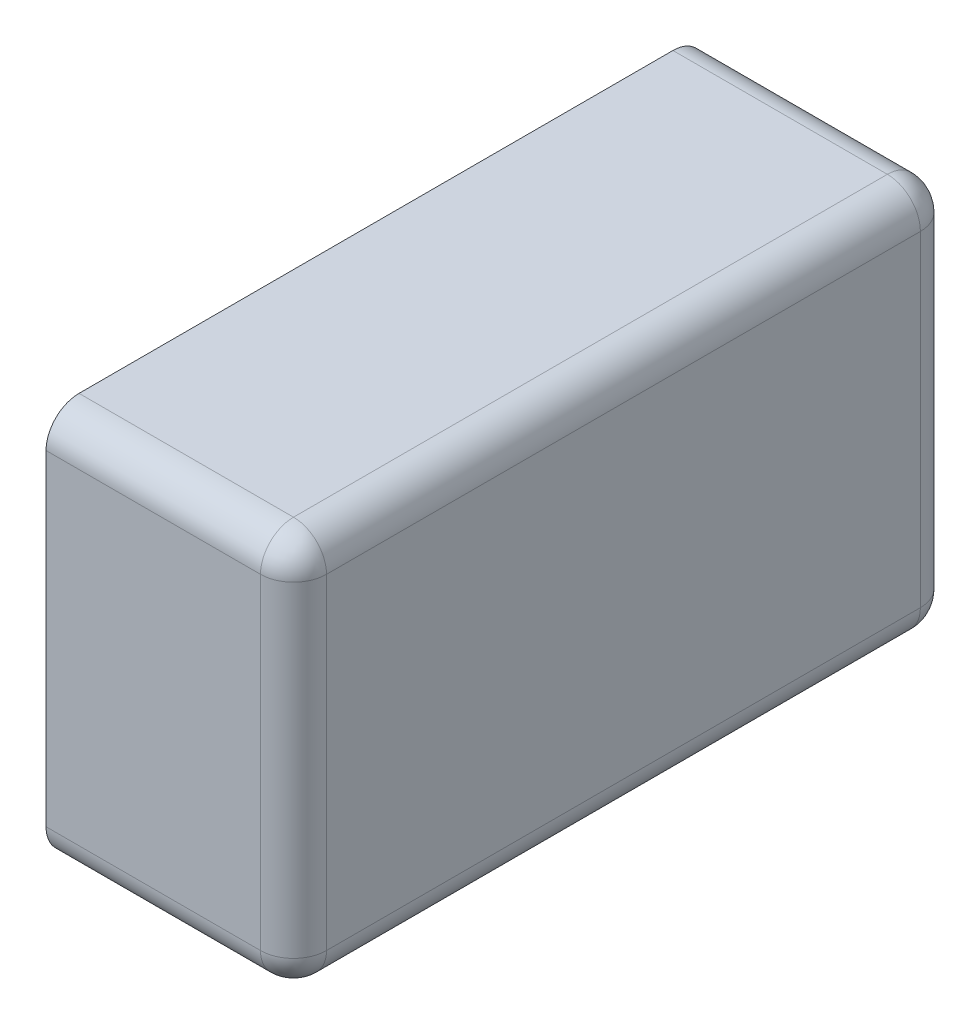
ISO-10303-21;
HEADER;
FILE_DESCRIPTION(('STEP AP214'),'2;1');
FILE_NAME('part.step','',(''),(''),'','','');
FILE_SCHEMA(('AUTOMOTIVE_DESIGN { 1 0 10303 214 1 1 1 1 }'));
ENDSEC;
DATA;
#1=APPLICATION_CONTEXT('core data for automotive mechanical design processes');
#2=APPLICATION_PROTOCOL_DEFINITION('international standard','automotive_design',2000,#1);
#3=PRODUCT_CONTEXT('',#1,'mechanical');
#4=PRODUCT('Part','Part','',(#3));
#5=PRODUCT_RELATED_PRODUCT_CATEGORY('part','',(#4));
#6=PRODUCT_DEFINITION_FORMATION('','',#4);
#7=PRODUCT_DEFINITION_CONTEXT('part definition',#1,'design');
#8=PRODUCT_DEFINITION('design','',#6,#7);
#9=PRODUCT_DEFINITION_SHAPE('','',#8);
#10=(LENGTH_UNIT() NAMED_UNIT(*) SI_UNIT(.MILLI.,.METRE.));
#11=(NAMED_UNIT(*) PLANE_ANGLE_UNIT() SI_UNIT($,.RADIAN.));
#12=(NAMED_UNIT(*) SI_UNIT($,.STERADIAN.) SOLID_ANGLE_UNIT());
#13=UNCERTAINTY_MEASURE_WITH_UNIT(LENGTH_MEASURE(1.E-05),#10,'distance_accuracy_value','');
#14=(GEOMETRIC_REPRESENTATION_CONTEXT(3) GLOBAL_UNCERTAINTY_ASSIGNED_CONTEXT((#13)) GLOBAL_UNIT_ASSIGNED_CONTEXT((#10,
#11,#12)) REPRESENTATION_CONTEXT('',''));
#15=CARTESIAN_POINT('',(0.,0.,0.));
#16=DIRECTION('',(0.,0.,1.));
#17=DIRECTION('',(1.,0.,0.));
#18=AXIS2_PLACEMENT_3D('',#15,#16,#17);
#19=CARTESIAN_POINT('',(1.6,0.95,-0.799999999999999));
#20=DIRECTION('',(-1.,0.,0.));
#21=DIRECTION('',(0.,0.,-1.));
#22=AXIS2_PLACEMENT_3D('',#19,#20,#21);
#23=PLANE('',#22);
#24=DIRECTION('',(0.,0.,-1.));
#25=VECTOR('',#24,1.);
#26=CARTESIAN_POINT('',(1.6,0.87,-0.799999999999999));
#27=LINE('',#26,#25);
#28=CARTESIAN_POINT('',(1.6,0.87,0.72));
#29=VERTEX_POINT('',#28);
#30=CARTESIAN_POINT('',(1.6,0.87,-0.72));
#31=VERTEX_POINT('',#30);
#32=EDGE_CURVE('E11',#29,#31,#27,.T.);
#33=ORIENTED_EDGE('',*,*,#32,.F.);
#34=DIRECTION('',(0.,1.,0.));
#35=VECTOR('',#34,1.);
#36=CARTESIAN_POINT('',(1.6,0.95,0.72));
#37=LINE('',#36,#35);
#38=CARTESIAN_POINT('',(1.6,0.08,0.72));
#39=VERTEX_POINT('',#38);
#40=EDGE_CURVE('E24',#39,#29,#37,.T.);
#41=ORIENTED_EDGE('',*,*,#40,.F.);
#42=DIRECTION('',(0.,0.,1.));
#43=VECTOR('',#42,1.);
#44=CARTESIAN_POINT('',(1.6,0.08,-0.799999999999999));
#45=LINE('',#44,#43);
#46=CARTESIAN_POINT('',(1.6,0.08,-0.72));
#47=VERTEX_POINT('',#46);
#48=EDGE_CURVE('E197',#47,#39,#45,.T.);
#49=ORIENTED_EDGE('',*,*,#48,.F.);
#50=DIRECTION('',(0.,-1.,0.));
#51=VECTOR('',#50,1.);
#52=CARTESIAN_POINT('',(1.6,0.95,-0.72));
#53=LINE('',#52,#51);
#54=EDGE_CURVE('E194',#31,#47,#53,.T.);
#55=ORIENTED_EDGE('',*,*,#54,.F.);
#56=EDGE_LOOP('',(#33,#41,#49,#55));
#57=FACE_BOUND('',#56,.T.);
#58=ADVANCED_FACE('F17',(#57),#23,.F.);
#59=CARTESIAN_POINT('',(1.6,0.95,0.8));
#60=DIRECTION('',(0.,0.,-1.));
#61=DIRECTION('',(1.,0.,0.));
#62=AXIS2_PLACEMENT_3D('',#59,#60,#61);
#63=PLANE('',#62);
#64=DIRECTION('',(0.,-1.,0.));
#65=VECTOR('',#64,1.);
#66=CARTESIAN_POINT('',(1.52,0.95,0.8));
#67=LINE('',#66,#65);
#68=CARTESIAN_POINT('',(1.52,0.87,0.8));
#69=VERTEX_POINT('',#68);
#70=CARTESIAN_POINT('',(1.52,0.08,0.8));
#71=VERTEX_POINT('',#70);
#72=EDGE_CURVE('E192',#69,#71,#67,.T.);
#73=ORIENTED_EDGE('',*,*,#72,.F.);
#74=DIRECTION('',(1.,0.,0.));
#75=VECTOR('',#74,1.);
#76=CARTESIAN_POINT('',(1.6,0.87,0.8));
#77=LINE('',#76,#75);
#78=CARTESIAN_POINT('',(1.,0.87,0.8));
#79=VERTEX_POINT('',#78);
#80=EDGE_CURVE('E189',#79,#69,#77,.T.);
#81=ORIENTED_EDGE('',*,*,#80,.F.);
#82=DIRECTION('',(0.,-1.,0.));
#83=VECTOR('',#82,1.);
#84=CARTESIAN_POINT('',(1.,0.95,0.8));
#85=LINE('',#84,#83);
#86=CARTESIAN_POINT('',(1.,0.0800000000000002,0.8));
#87=VERTEX_POINT('',#86);
#88=EDGE_CURVE('E187',#79,#87,#85,.T.);
#89=ORIENTED_EDGE('',*,*,#88,.T.);
#90=DIRECTION('',(-1.,0.,0.));
#91=VECTOR('',#90,1.);
#92=CARTESIAN_POINT('',(1.6,0.08,0.8));
#93=LINE('',#92,#91);
#94=EDGE_CURVE('E184',#71,#87,#93,.T.);
#95=ORIENTED_EDGE('',*,*,#94,.F.);
#96=EDGE_LOOP('',(#73,#81,#89,#95));
#97=FACE_BOUND('',#96,.T.);
#98=ADVANCED_FACE('F213',(#97),#63,.F.);
#99=CARTESIAN_POINT('',(1.,0.95,-0.8));
#100=DIRECTION('',(1.,0.,0.));
#101=DIRECTION('',(0.,0.,1.));
#102=AXIS2_PLACEMENT_3D('',#99,#100,#101);
#103=PLANE('',#102);
#104=DIRECTION('',(0.,0.,-1.));
#105=VECTOR('',#104,1.);
#106=CARTESIAN_POINT('',(1.,0.,-0.8));
#107=LINE('',#106,#105);
#108=CARTESIAN_POINT('',(1.,0.,0.72));
#109=VERTEX_POINT('',#108);
#110=CARTESIAN_POINT('',(1.,0.,-0.72));
#111=VERTEX_POINT('',#110);
#112=EDGE_CURVE('E108',#109,#111,#107,.T.);
#113=ORIENTED_EDGE('',*,*,#112,.F.);
#114=CARTESIAN_POINT('',(1.,0.08,0.72));
#115=DIRECTION('',(1.,0.,0.));
#116=DIRECTION('',(0.,0.,1.));
#117=AXIS2_PLACEMENT_3D('',#114,#115,#116);
#118=CIRCLE('',#117,0.08);
#119=EDGE_CURVE('E180',#87,#109,#118,.T.);
#120=ORIENTED_EDGE('',*,*,#119,.F.);
#121=ORIENTED_EDGE('',*,*,#88,.F.);
#122=CARTESIAN_POINT('',(1.,0.87,0.72));
#123=DIRECTION('',(1.,0.,0.));
#124=DIRECTION('',(0.,0.,1.));
#125=AXIS2_PLACEMENT_3D('',#122,#123,#124);
#126=CIRCLE('',#125,0.08);
#127=CARTESIAN_POINT('',(1.,0.95,0.72));
#128=VERTEX_POINT('',#127);
#129=EDGE_CURVE('E177',#128,#79,#126,.T.);
#130=ORIENTED_EDGE('',*,*,#129,.F.);
#131=DIRECTION('',(0.,0.,-1.));
#132=VECTOR('',#131,1.);
#133=CARTESIAN_POINT('',(1.,0.95,-0.8));
#134=LINE('',#133,#132);
#135=CARTESIAN_POINT('',(1.,0.95,-0.72));
#136=VERTEX_POINT('',#135);
#137=EDGE_CURVE('E175',#128,#136,#134,.T.);
#138=ORIENTED_EDGE('',*,*,#137,.T.);
#139=CARTESIAN_POINT('',(1.,0.87,-0.72));
#140=DIRECTION('',(1.,0.,0.));
#141=DIRECTION('',(0.,0.,1.));
#142=AXIS2_PLACEMENT_3D('',#139,#140,#141);
#143=CIRCLE('',#142,0.08);
#144=CARTESIAN_POINT('',(1.,0.87,-0.8));
#145=VERTEX_POINT('',#144);
#146=EDGE_CURVE('E172',#145,#136,#143,.T.);
#147=ORIENTED_EDGE('',*,*,#146,.F.);
#148=DIRECTION('',(0.,-1.,0.));
#149=VECTOR('',#148,1.);
#150=CARTESIAN_POINT('',(1.,0.95,-0.8));
#151=LINE('',#150,#149);
#152=CARTESIAN_POINT('',(1.,0.0800000000000002,-0.8));
#153=VERTEX_POINT('',#152);
#154=EDGE_CURVE('E170',#145,#153,#151,.T.);
#155=ORIENTED_EDGE('',*,*,#154,.T.);
#156=CARTESIAN_POINT('',(1.,0.08,-0.72));
#157=DIRECTION('',(1.,0.,0.));
#158=DIRECTION('',(0.,0.,1.));
#159=AXIS2_PLACEMENT_3D('',#156,#157,#158);
#160=CIRCLE('',#159,0.08);
#161=EDGE_CURVE('E168',#111,#153,#160,.T.);
#162=ORIENTED_EDGE('',*,*,#161,.F.);
#163=EDGE_LOOP('',(#113,#120,#121,#130,#138,#147,#155,#162));
#164=FACE_BOUND('',#163,.T.);
#165=ADVANCED_FACE('F217',(#164),#103,.F.);
#166=CARTESIAN_POINT('',(1.6,0.95,-0.799999999999999));
#167=DIRECTION('',(0.,0.,1.));
#168=DIRECTION('',(-1.,0.,0.));
#169=AXIS2_PLACEMENT_3D('',#166,#167,#168);
#170=PLANE('',#169);
#171=ORIENTED_EDGE('',*,*,#154,.F.);
#172=DIRECTION('',(-1.,0.,0.));
#173=VECTOR('',#172,1.);
#174=CARTESIAN_POINT('',(1.,0.87,-0.8));
#175=LINE('',#174,#173);
#176=CARTESIAN_POINT('',(1.52,0.87,-0.799999999999999));
#177=VERTEX_POINT('',#176);
#178=EDGE_CURVE('E165',#177,#145,#175,.T.);
#179=ORIENTED_EDGE('',*,*,#178,.F.);
#180=DIRECTION('',(0.,1.,0.));
#181=VECTOR('',#180,1.);
#182=CARTESIAN_POINT('',(1.52,0.95,-0.799999999999999));
#183=LINE('',#182,#181);
#184=CARTESIAN_POINT('',(1.52,0.08,-0.799999999999999));
#185=VERTEX_POINT('',#184);
#186=EDGE_CURVE('E162',#185,#177,#183,.T.);
#187=ORIENTED_EDGE('',*,*,#186,.F.);
#188=DIRECTION('',(1.,0.,0.));
#189=VECTOR('',#188,1.);
#190=CARTESIAN_POINT('',(1.6,0.08,-0.799999999999999));
#191=LINE('',#190,#189);
#192=EDGE_CURVE('E126',#153,#185,#191,.T.);
#193=ORIENTED_EDGE('',*,*,#192,.F.);
#194=EDGE_LOOP('',(#171,#179,#187,#193));
#195=FACE_BOUND('',#194,.T.);
#196=ADVANCED_FACE('F242',(#195),#170,.F.);
#197=CARTESIAN_POINT('',(0.,0.95,0.));
#198=DIRECTION('',(0.,1.,0.));
#199=DIRECTION('',(0.,0.,1.));
#200=AXIS2_PLACEMENT_3D('',#197,#198,#199);
#201=PLANE('',#200);
#202=ORIENTED_EDGE('',*,*,#137,.F.);
#203=DIRECTION('',(-1.,0.,0.));
#204=VECTOR('',#203,1.);
#205=CARTESIAN_POINT('',(1.,0.95,0.72));
#206=LINE('',#205,#204);
#207=CARTESIAN_POINT('',(1.52,0.95,0.72));
#208=VERTEX_POINT('',#207);
#209=EDGE_CURVE('E158',#208,#128,#206,.T.);
#210=ORIENTED_EDGE('',*,*,#209,.F.);
#211=DIRECTION('',(0.,0.,1.));
#212=VECTOR('',#211,1.);
#213=CARTESIAN_POINT('',(1.52,0.95,0.8));
#214=LINE('',#213,#212);
#215=CARTESIAN_POINT('',(1.52,0.95,-0.72));
#216=VERTEX_POINT('',#215);
#217=EDGE_CURVE('E155',#216,#208,#214,.T.);
#218=ORIENTED_EDGE('',*,*,#217,.F.);
#219=DIRECTION('',(1.,0.,0.));
#220=VECTOR('',#219,1.);
#221=CARTESIAN_POINT('',(1.6,0.95,-0.72));
#222=LINE('',#221,#220);
#223=EDGE_CURVE('E102',#136,#216,#222,.T.);
#224=ORIENTED_EDGE('',*,*,#223,.F.);
#225=EDGE_LOOP('',(#202,#210,#218,#224));
#226=FACE_BOUND('',#225,.T.);
#227=ADVANCED_FACE('F247',(#226),#201,.T.);
#228=CARTESIAN_POINT('',(0.,0.,0.));
#229=DIRECTION('',(0.,1.,0.));
#230=DIRECTION('',(0.,0.,1.));
#231=AXIS2_PLACEMENT_3D('',#228,#229,#230);
#232=PLANE('',#231);
#233=DIRECTION('',(0.,0.,-1.));
#234=VECTOR('',#233,1.);
#235=CARTESIAN_POINT('',(1.52,0.,0.));
#236=LINE('',#235,#234);
#237=CARTESIAN_POINT('',(1.52,0.,0.72));
#238=VERTEX_POINT('',#237);
#239=CARTESIAN_POINT('',(1.52,0.,-0.72));
#240=VERTEX_POINT('',#239);
#241=EDGE_CURVE('E90',#238,#240,#236,.T.);
#242=ORIENTED_EDGE('',*,*,#241,.F.);
#243=DIRECTION('',(1.,0.,0.));
#244=VECTOR('',#243,1.);
#245=CARTESIAN_POINT('',(0.,0.,0.72));
#246=LINE('',#245,#244);
#247=EDGE_CURVE('E103',#109,#238,#246,.T.);
#248=ORIENTED_EDGE('',*,*,#247,.F.);
#249=ORIENTED_EDGE('',*,*,#112,.T.);
#250=DIRECTION('',(-1.,0.,0.));
#251=VECTOR('',#250,1.);
#252=CARTESIAN_POINT('',(0.,0.,-0.72));
#253=LINE('',#252,#251);
#254=EDGE_CURVE('E106',#240,#111,#253,.T.);
#255=ORIENTED_EDGE('',*,*,#254,.F.);
#256=EDGE_LOOP('',(#242,#248,#249,#255));
#257=FACE_BOUND('',#256,.T.);
#258=ADVANCED_FACE('F107',(#257),#232,.F.);
#259=CARTESIAN_POINT('',(0.,0.87,0.72));
#260=DIRECTION('',(1.,0.,0.));
#261=DIRECTION('',(0.,0.,1.));
#262=AXIS2_PLACEMENT_3D('',#259,#260,#261);
#263=CYLINDRICAL_SURFACE('',#262,0.08);
#264=ORIENTED_EDGE('',*,*,#129,.T.);
#265=ORIENTED_EDGE('',*,*,#80,.T.);
#266=CARTESIAN_POINT('',(1.52,0.87,0.72));
#267=DIRECTION('',(-1.,0.,0.));
#268=DIRECTION('',(0.,0.,1.));
#269=AXIS2_PLACEMENT_3D('',#266,#267,#268);
#270=CIRCLE('',#269,0.08);
#271=EDGE_CURVE('E113',#69,#208,#270,.T.);
#272=ORIENTED_EDGE('',*,*,#271,.T.);
#273=ORIENTED_EDGE('',*,*,#209,.T.);
#274=EDGE_LOOP('',(#264,#265,#272,#273));
#275=FACE_BOUND('',#274,.T.);
#276=ADVANCED_FACE('F210',(#275),#263,.T.);
#277=CARTESIAN_POINT('',(1.52,0.95,0.72));
#278=DIRECTION('',(0.,-1.,0.));
#279=DIRECTION('',(0.,0.,-1.));
#280=AXIS2_PLACEMENT_3D('',#277,#278,#279);
#281=CYLINDRICAL_SURFACE('',#280,0.08);
#282=CARTESIAN_POINT('',(1.52,0.08,0.72));
#283=DIRECTION('',(0.,1.,0.));
#284=DIRECTION('',(0.,0.,-1.));
#285=AXIS2_PLACEMENT_3D('',#282,#283,#284);
#286=CIRCLE('',#285,0.08);
#287=EDGE_CURVE('E147',#71,#39,#286,.T.);
#288=ORIENTED_EDGE('',*,*,#287,.T.);
#289=ORIENTED_EDGE('',*,*,#40,.T.);
#290=CARTESIAN_POINT('',(1.52,0.87,0.72));
#291=DIRECTION('',(0.,-1.,0.));
#292=DIRECTION('',(0.,0.,1.));
#293=AXIS2_PLACEMENT_3D('',#290,#291,#292);
#294=CIRCLE('',#293,0.08);
#295=EDGE_CURVE('E144',#29,#69,#294,.T.);
#296=ORIENTED_EDGE('',*,*,#295,.T.);
#297=ORIENTED_EDGE('',*,*,#72,.T.);
#298=EDGE_LOOP('',(#288,#289,#296,#297));
#299=FACE_BOUND('',#298,.T.);
#300=ADVANCED_FACE('F200',(#299),#281,.T.);
#301=CARTESIAN_POINT('',(1.6,0.08,0.72));
#302=DIRECTION('',(-1.,0.,0.));
#303=DIRECTION('',(0.,0.,-1.));
#304=AXIS2_PLACEMENT_3D('',#301,#302,#303);
#305=CYLINDRICAL_SURFACE('',#304,0.08);
#306=ORIENTED_EDGE('',*,*,#119,.T.);
#307=ORIENTED_EDGE('',*,*,#247,.T.);
#308=CARTESIAN_POINT('',(1.52,0.08,0.72));
#309=DIRECTION('',(-1.,0.,0.));
#310=DIRECTION('',(0.,0.,1.));
#311=AXIS2_PLACEMENT_3D('',#308,#309,#310);
#312=CIRCLE('',#311,0.08);
#313=EDGE_CURVE('E141',#238,#71,#312,.T.);
#314=ORIENTED_EDGE('',*,*,#313,.T.);
#315=ORIENTED_EDGE('',*,*,#94,.T.);
#316=EDGE_LOOP('',(#306,#307,#314,#315));
#317=FACE_BOUND('',#316,.T.);
#318=ADVANCED_FACE('F220',(#317),#305,.T.);
#319=CARTESIAN_POINT('',(1.52,0.87,0.72));
#320=DIRECTION('',(0.,-1.,0.));
#321=DIRECTION('',(-1.,0.,0.));
#322=AXIS2_PLACEMENT_3D('',#319,#320,#321);
#323=SPHERICAL_SURFACE('',#322,0.08);
#324=ORIENTED_EDGE('',*,*,#295,.F.);
#325=CARTESIAN_POINT('',(1.52,0.87,0.72));
#326=DIRECTION('',(0.,0.,1.));
#327=DIRECTION('',(-1.,0.,0.));
#328=AXIS2_PLACEMENT_3D('',#325,#326,#327);
#329=CIRCLE('',#328,0.08);
#330=EDGE_CURVE('E138',#29,#208,#329,.T.);
#331=ORIENTED_EDGE('',*,*,#330,.T.);
#332=ORIENTED_EDGE('',*,*,#271,.F.);
#333=EDGE_LOOP('',(#324,#331,#332));
#334=FACE_BOUND('',#333,.T.);
#335=ADVANCED_FACE('F204',(#334),#323,.T.);
#336=CARTESIAN_POINT('',(1.52,0.08,0.72));
#337=DIRECTION('',(0.,-1.,0.));
#338=DIRECTION('',(-1.,0.,0.));
#339=AXIS2_PLACEMENT_3D('',#336,#337,#338);
#340=SPHERICAL_SURFACE('',#339,0.08);
#341=ORIENTED_EDGE('',*,*,#313,.F.);
#342=CARTESIAN_POINT('',(1.52,0.08,0.72));
#343=DIRECTION('',(0.,0.,1.));
#344=DIRECTION('',(-1.,0.,0.));
#345=AXIS2_PLACEMENT_3D('',#342,#343,#344);
#346=CIRCLE('',#345,0.08);
#347=EDGE_CURVE('E98',#238,#39,#346,.T.);
#348=ORIENTED_EDGE('',*,*,#347,.T.);
#349=ORIENTED_EDGE('',*,*,#287,.F.);
#350=EDGE_LOOP('',(#341,#348,#349));
#351=FACE_BOUND('',#350,.T.);
#352=ADVANCED_FACE('F223',(#351),#340,.T.);
#353=CARTESIAN_POINT('',(0.,0.87,-0.72));
#354=DIRECTION('',(-1.,0.,0.));
#355=DIRECTION('',(0.,0.,-1.));
#356=AXIS2_PLACEMENT_3D('',#353,#354,#355);
#357=CYLINDRICAL_SURFACE('',#356,0.08);
#358=ORIENTED_EDGE('',*,*,#146,.T.);
#359=ORIENTED_EDGE('',*,*,#223,.T.);
#360=CARTESIAN_POINT('',(1.52,0.87,-0.72));
#361=DIRECTION('',(-1.,0.,0.));
#362=DIRECTION('',(0.,0.,1.));
#363=AXIS2_PLACEMENT_3D('',#360,#361,#362);
#364=CIRCLE('',#363,0.08);
#365=EDGE_CURVE('E134',#216,#177,#364,.T.);
#366=ORIENTED_EDGE('',*,*,#365,.T.);
#367=ORIENTED_EDGE('',*,*,#178,.T.);
#368=EDGE_LOOP('',(#358,#359,#366,#367));
#369=FACE_BOUND('',#368,.T.);
#370=ADVANCED_FACE('F225',(#369),#357,.T.);
#371=CARTESIAN_POINT('',(1.52,0.87,0.));
#372=DIRECTION('',(0.,0.,-1.));
#373=DIRECTION('',(1.,0.,0.));
#374=AXIS2_PLACEMENT_3D('',#371,#372,#373);
#375=CYLINDRICAL_SURFACE('',#374,0.08);
#376=ORIENTED_EDGE('',*,*,#330,.F.);
#377=ORIENTED_EDGE('',*,*,#32,.T.);
#378=CARTESIAN_POINT('',(1.52,0.87,-0.72));
#379=DIRECTION('',(0.,0.,1.));
#380=DIRECTION('',(1.,0.,0.));
#381=AXIS2_PLACEMENT_3D('',#378,#379,#380);
#382=CIRCLE('',#381,0.08);
#383=EDGE_CURVE('E121',#31,#216,#382,.T.);
#384=ORIENTED_EDGE('',*,*,#383,.T.);
#385=ORIENTED_EDGE('',*,*,#217,.T.);
#386=EDGE_LOOP('',(#376,#377,#384,#385));
#387=FACE_BOUND('',#386,.T.);
#388=ADVANCED_FACE('F205',(#387),#375,.T.);
#389=CARTESIAN_POINT('',(1.52,0.08,-0.799999999999999));
#390=DIRECTION('',(0.,0.,1.));
#391=DIRECTION('',(-1.,0.,0.));
#392=AXIS2_PLACEMENT_3D('',#389,#390,#391);
#393=CYLINDRICAL_SURFACE('',#392,0.08);
#394=ORIENTED_EDGE('',*,*,#347,.F.);
#395=ORIENTED_EDGE('',*,*,#241,.T.);
#396=CARTESIAN_POINT('',(1.52,0.08,-0.72));
#397=DIRECTION('',(0.,0.,1.));
#398=DIRECTION('',(1.,0.,0.));
#399=AXIS2_PLACEMENT_3D('',#396,#397,#398);
#400=CIRCLE('',#399,0.08);
#401=EDGE_CURVE('E95',#240,#47,#400,.T.);
#402=ORIENTED_EDGE('',*,*,#401,.T.);
#403=ORIENTED_EDGE('',*,*,#48,.T.);
#404=EDGE_LOOP('',(#394,#395,#402,#403));
#405=FACE_BOUND('',#404,.T.);
#406=ADVANCED_FACE('F92',(#405),#393,.T.);
#407=CARTESIAN_POINT('',(1.6,0.08,-0.72));
#408=DIRECTION('',(1.,0.,0.));
#409=DIRECTION('',(0.,0.,1.));
#410=AXIS2_PLACEMENT_3D('',#407,#408,#409);
#411=CYLINDRICAL_SURFACE('',#410,0.08);
#412=ORIENTED_EDGE('',*,*,#161,.T.);
#413=ORIENTED_EDGE('',*,*,#192,.T.);
#414=CARTESIAN_POINT('',(1.52,0.08,-0.72));
#415=DIRECTION('',(-1.,0.,0.));
#416=DIRECTION('',(0.,0.,1.));
#417=AXIS2_PLACEMENT_3D('',#414,#415,#416);
#418=CIRCLE('',#417,0.08);
#419=EDGE_CURVE('E118',#185,#240,#418,.T.);
#420=ORIENTED_EDGE('',*,*,#419,.T.);
#421=ORIENTED_EDGE('',*,*,#254,.T.);
#422=EDGE_LOOP('',(#412,#413,#420,#421));
#423=FACE_BOUND('',#422,.T.);
#424=ADVANCED_FACE('F124',(#423),#411,.T.);
#425=CARTESIAN_POINT('',(1.52,0.87,-0.72));
#426=DIRECTION('',(0.,-1.,0.));
#427=DIRECTION('',(-1.,0.,0.));
#428=AXIS2_PLACEMENT_3D('',#425,#426,#427);
#429=SPHERICAL_SURFACE('',#428,0.08);
#430=ORIENTED_EDGE('',*,*,#383,.F.);
#431=CARTESIAN_POINT('',(1.52,0.87,-0.72));
#432=DIRECTION('',(0.,1.,0.));
#433=DIRECTION('',(0.,0.,1.));
#434=AXIS2_PLACEMENT_3D('',#431,#432,#433);
#435=CIRCLE('',#434,0.08);
#436=EDGE_CURVE('E127',#31,#177,#435,.T.);
#437=ORIENTED_EDGE('',*,*,#436,.T.);
#438=ORIENTED_EDGE('',*,*,#365,.F.);
#439=EDGE_LOOP('',(#430,#437,#438));
#440=FACE_BOUND('',#439,.T.);
#441=ADVANCED_FACE('F309',(#440),#429,.T.);
#442=CARTESIAN_POINT('',(1.52,0.08,-0.72));
#443=DIRECTION('',(0.,-1.,0.));
#444=DIRECTION('',(-1.,0.,0.));
#445=AXIS2_PLACEMENT_3D('',#442,#443,#444);
#446=SPHERICAL_SURFACE('',#445,0.08);
#447=ORIENTED_EDGE('',*,*,#419,.F.);
#448=CARTESIAN_POINT('',(1.52,0.08,-0.72));
#449=DIRECTION('',(0.,-1.,0.));
#450=DIRECTION('',(0.,0.,-1.));
#451=AXIS2_PLACEMENT_3D('',#448,#449,#450);
#452=CIRCLE('',#451,0.08);
#453=EDGE_CURVE('E120',#185,#47,#452,.T.);
#454=ORIENTED_EDGE('',*,*,#453,.T.);
#455=ORIENTED_EDGE('',*,*,#401,.F.);
#456=EDGE_LOOP('',(#447,#454,#455));
#457=FACE_BOUND('',#456,.T.);
#458=ADVANCED_FACE('F117',(#457),#446,.T.);
#459=CARTESIAN_POINT('',(1.52,0.95,-0.72));
#460=DIRECTION('',(0.,-1.,0.));
#461=DIRECTION('',(0.,0.,-1.));
#462=AXIS2_PLACEMENT_3D('',#459,#460,#461);
#463=CYLINDRICAL_SURFACE('',#462,0.08);
#464=ORIENTED_EDGE('',*,*,#436,.F.);
#465=ORIENTED_EDGE('',*,*,#54,.T.);
#466=ORIENTED_EDGE('',*,*,#453,.F.);
#467=ORIENTED_EDGE('',*,*,#186,.T.);
#468=EDGE_LOOP('',(#464,#465,#466,#467));
#469=FACE_BOUND('',#468,.T.);
#470=ADVANCED_FACE('F327',(#469),#463,.T.);
#471=CLOSED_SHELL('',(#58,#98,#165,#196,#227,#258,#276,#300,#318,#335,#352,#370,#388,#406,#424,
#441,#458,#470));
#472=MANIFOLD_SOLID_BREP('B1',#471);
#473=ADVANCED_BREP_SHAPE_REPRESENTATION('',(#18,#472),#14);
#474=SHAPE_DEFINITION_REPRESENTATION(#9,#473);
ENDSEC;
END-ISO-10303-21;
